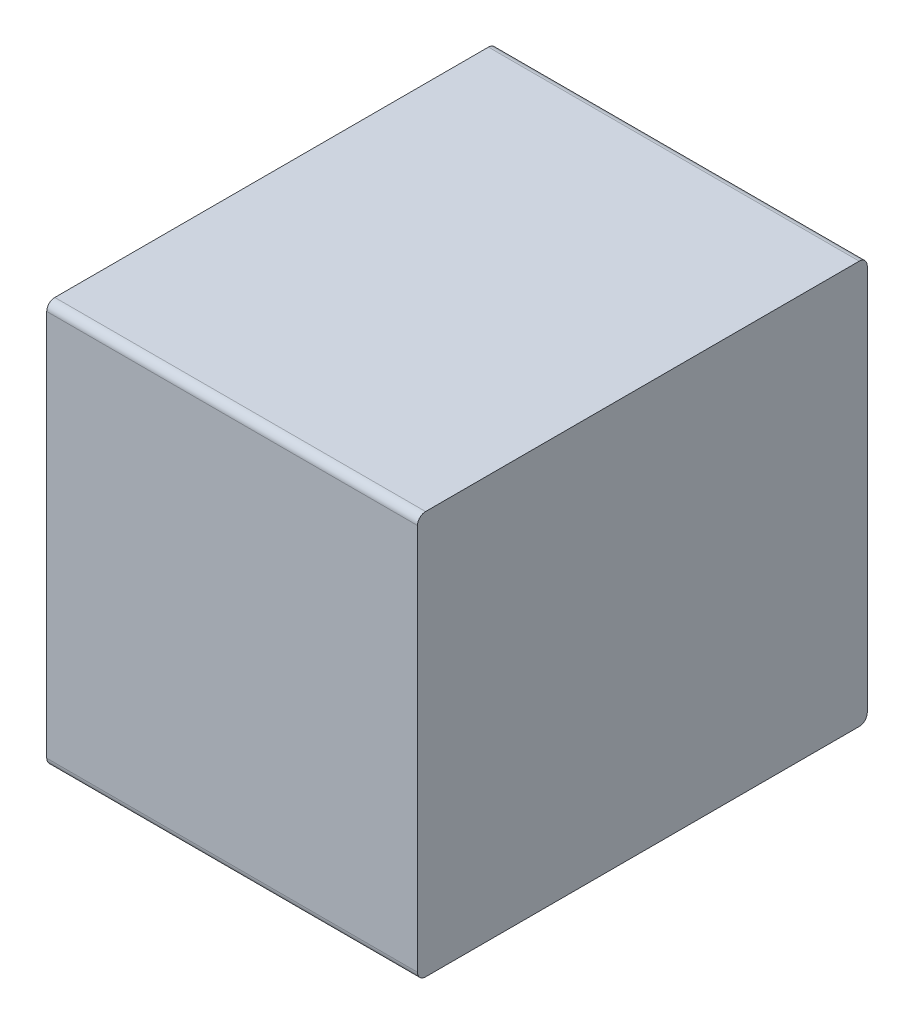
ISO-10303-21;
HEADER;
FILE_DESCRIPTION(('STEP AP214'),'2;1');
FILE_NAME('part.step','',(''),(''),'','','');
FILE_SCHEMA(('AUTOMOTIVE_DESIGN { 1 0 10303 214 1 1 1 1 }'));
ENDSEC;
DATA;
#1=APPLICATION_CONTEXT('core data for automotive mechanical design processes');
#2=APPLICATION_PROTOCOL_DEFINITION('international standard','automotive_design',2000,#1);
#3=PRODUCT_CONTEXT('',#1,'mechanical');
#4=PRODUCT('Part','Part','',(#3));
#5=PRODUCT_RELATED_PRODUCT_CATEGORY('part','',(#4));
#6=PRODUCT_DEFINITION_FORMATION('','',#4);
#7=PRODUCT_DEFINITION_CONTEXT('part definition',#1,'design');
#8=PRODUCT_DEFINITION('design','',#6,#7);
#9=PRODUCT_DEFINITION_SHAPE('','',#8);
#10=(LENGTH_UNIT() NAMED_UNIT(*) SI_UNIT(.MILLI.,.METRE.));
#11=(NAMED_UNIT(*) PLANE_ANGLE_UNIT() SI_UNIT($,.RADIAN.));
#12=(NAMED_UNIT(*) SI_UNIT($,.STERADIAN.) SOLID_ANGLE_UNIT());
#13=UNCERTAINTY_MEASURE_WITH_UNIT(LENGTH_MEASURE(1.E-05),#10,'distance_accuracy_value','');
#14=(GEOMETRIC_REPRESENTATION_CONTEXT(3) GLOBAL_UNCERTAINTY_ASSIGNED_CONTEXT((#13)) GLOBAL_UNIT_ASSIGNED_CONTEXT((#10,
#11,#12)) REPRESENTATION_CONTEXT('',''));
#15=CARTESIAN_POINT('',(0.,0.,0.));
#16=DIRECTION('',(0.,0.,1.));
#17=DIRECTION('',(1.,0.,0.));
#18=AXIS2_PLACEMENT_3D('',#15,#16,#17);
#19=CARTESIAN_POINT('',(1.15,1.799359773159,2.79));
#20=DIRECTION('',(1.,0.,0.));
#21=DIRECTION('',(0.,-1.,0.));
#22=AXIS2_PLACEMENT_3D('',#19,#20,#21);
#23=PLANE('',#22);
#24=CARTESIAN_POINT('',(1.15,-1.2,2.74));
#25=DIRECTION('',(1.,0.,0.));
#26=DIRECTION('',(0.,-0.707106781186548,0.707106781186548));
#27=AXIS2_PLACEMENT_3D('',#24,#25,#26);
#28=CIRCLE('',#27,0.05);
#29=CARTESIAN_POINT('',(1.15,-1.2,2.79));
#30=VERTEX_POINT('',#29);
#31=CARTESIAN_POINT('',(1.15,-1.25,2.74));
#32=VERTEX_POINT('',#31);
#33=EDGE_CURVE('E11',#30,#32,#28,.T.);
#34=ORIENTED_EDGE('',*,*,#33,.T.);
#35=DIRECTION('',(0.,0.,-1.));
#36=VECTOR('',#35,1.);
#37=CARTESIAN_POINT('',(1.15,-1.25,1.395));
#38=LINE('',#37,#36);
#39=CARTESIAN_POINT('',(1.15,-1.25,0.05));
#40=VERTEX_POINT('',#39);
#41=EDGE_CURVE('E24',#32,#40,#38,.T.);
#42=ORIENTED_EDGE('',*,*,#41,.T.);
#43=CARTESIAN_POINT('',(1.15,-1.2,0.05));
#44=DIRECTION('',(1.,0.,0.));
#45=DIRECTION('',(0.,-0.707106781186548,-0.707106781186547));
#46=AXIS2_PLACEMENT_3D('',#43,#44,#45);
#47=CIRCLE('',#46,0.05);
#48=CARTESIAN_POINT('',(1.15,-1.2,0.));
#49=VERTEX_POINT('',#48);
#50=EDGE_CURVE('E99',#40,#49,#47,.T.);
#51=ORIENTED_EDGE('',*,*,#50,.T.);
#52=DIRECTION('',(0.,1.,0.));
#53=VECTOR('',#52,1.);
#54=CARTESIAN_POINT('',(1.15,0.899679886579503,0.));
#55=LINE('',#54,#53);
#56=CARTESIAN_POINT('',(1.15,1.2,0.));
#57=VERTEX_POINT('',#56);
#58=EDGE_CURVE('E137',#49,#57,#55,.T.);
#59=ORIENTED_EDGE('',*,*,#58,.T.);
#60=CARTESIAN_POINT('',(1.15,1.2,0.05));
#61=DIRECTION('',(1.,0.,0.));
#62=DIRECTION('',(0.,0.707106781186548,-0.707106781186547));
#63=AXIS2_PLACEMENT_3D('',#60,#61,#62);
#64=CIRCLE('',#63,0.05);
#65=CARTESIAN_POINT('',(1.15,1.25,0.05));
#66=VERTEX_POINT('',#65);
#67=EDGE_CURVE('E135',#57,#66,#64,.T.);
#68=ORIENTED_EDGE('',*,*,#67,.T.);
#69=DIRECTION('',(0.,0.,1.));
#70=VECTOR('',#69,1.);
#71=CARTESIAN_POINT('',(1.15,1.25,1.395));
#72=LINE('',#71,#70);
#73=CARTESIAN_POINT('',(1.15,1.25,2.74));
#74=VERTEX_POINT('',#73);
#75=EDGE_CURVE('E133',#66,#74,#72,.T.);
#76=ORIENTED_EDGE('',*,*,#75,.T.);
#77=CARTESIAN_POINT('',(1.15,1.2,2.74));
#78=DIRECTION('',(1.,0.,0.));
#79=DIRECTION('',(0.,0.707106781186548,0.707106781186548));
#80=AXIS2_PLACEMENT_3D('',#77,#78,#79);
#81=CIRCLE('',#80,0.05);
#82=CARTESIAN_POINT('',(1.15,1.2,2.79));
#83=VERTEX_POINT('',#82);
#84=EDGE_CURVE('E131',#74,#83,#81,.T.);
#85=ORIENTED_EDGE('',*,*,#84,.T.);
#86=DIRECTION('',(0.,-1.,0.));
#87=VECTOR('',#86,1.);
#88=CARTESIAN_POINT('',(1.15,0.899679886579503,2.79));
#89=LINE('',#88,#87);
#90=EDGE_CURVE('E129',#83,#30,#89,.T.);
#91=ORIENTED_EDGE('',*,*,#90,.T.);
#92=EDGE_LOOP('',(#34,#42,#51,#59,#68,#76,#85,#91));
#93=FACE_BOUND('',#92,.T.);
#94=ADVANCED_FACE('F17',(#93),#23,.T.);
#95=CARTESIAN_POINT('',(-1.15,-1.799359773159,2.79));
#96=DIRECTION('',(-1.,0.,0.));
#97=DIRECTION('',(0.,1.,0.));
#98=AXIS2_PLACEMENT_3D('',#95,#96,#97);
#99=PLANE('',#98);
#100=CARTESIAN_POINT('',(-1.15,-1.2,2.74));
#101=DIRECTION('',(-1.,0.,0.));
#102=DIRECTION('',(0.,-0.707106781186548,0.707106781186548));
#103=AXIS2_PLACEMENT_3D('',#100,#101,#102);
#104=CIRCLE('',#103,0.05);
#105=CARTESIAN_POINT('',(-1.15,-1.25,2.74));
#106=VERTEX_POINT('',#105);
#107=CARTESIAN_POINT('',(-1.15,-1.2,2.79));
#108=VERTEX_POINT('',#107);
#109=EDGE_CURVE('E127',#106,#108,#104,.T.);
#110=ORIENTED_EDGE('',*,*,#109,.T.);
#111=DIRECTION('',(0.,1.,0.));
#112=VECTOR('',#111,1.);
#113=CARTESIAN_POINT('',(-1.15,-0.899679886579503,2.79));
#114=LINE('',#113,#112);
#115=CARTESIAN_POINT('',(-1.15,1.2,2.79));
#116=VERTEX_POINT('',#115);
#117=EDGE_CURVE('E125',#108,#116,#114,.T.);
#118=ORIENTED_EDGE('',*,*,#117,.T.);
#119=CARTESIAN_POINT('',(-1.15,1.2,2.74));
#120=DIRECTION('',(-1.,0.,0.));
#121=DIRECTION('',(0.,0.707106781186548,0.707106781186548));
#122=AXIS2_PLACEMENT_3D('',#119,#120,#121);
#123=CIRCLE('',#122,0.05);
#124=CARTESIAN_POINT('',(-1.15,1.25,2.74));
#125=VERTEX_POINT('',#124);
#126=EDGE_CURVE('E123',#116,#125,#123,.T.);
#127=ORIENTED_EDGE('',*,*,#126,.T.);
#128=DIRECTION('',(0.,0.,-1.));
#129=VECTOR('',#128,1.);
#130=CARTESIAN_POINT('',(-1.15,1.25,1.395));
#131=LINE('',#130,#129);
#132=CARTESIAN_POINT('',(-1.15,1.25,0.05));
#133=VERTEX_POINT('',#132);
#134=EDGE_CURVE('E121',#125,#133,#131,.T.);
#135=ORIENTED_EDGE('',*,*,#134,.T.);
#136=CARTESIAN_POINT('',(-1.15,1.2,0.05));
#137=DIRECTION('',(-1.,0.,0.));
#138=DIRECTION('',(0.,0.707106781186548,-0.707106781186547));
#139=AXIS2_PLACEMENT_3D('',#136,#137,#138);
#140=CIRCLE('',#139,0.05);
#141=CARTESIAN_POINT('',(-1.15,1.2,0.));
#142=VERTEX_POINT('',#141);
#143=EDGE_CURVE('E119',#133,#142,#140,.T.);
#144=ORIENTED_EDGE('',*,*,#143,.T.);
#145=DIRECTION('',(0.,-1.,0.));
#146=VECTOR('',#145,1.);
#147=CARTESIAN_POINT('',(-1.15,-0.899679886579503,0.));
#148=LINE('',#147,#146);
#149=CARTESIAN_POINT('',(-1.15,-1.2,0.));
#150=VERTEX_POINT('',#149);
#151=EDGE_CURVE('E84',#142,#150,#148,.T.);
#152=ORIENTED_EDGE('',*,*,#151,.T.);
#153=CARTESIAN_POINT('',(-1.15,-1.2,0.05));
#154=DIRECTION('',(-1.,0.,0.));
#155=DIRECTION('',(0.,-0.707106781186548,-0.707106781186547));
#156=AXIS2_PLACEMENT_3D('',#153,#154,#155);
#157=CIRCLE('',#156,0.05);
#158=CARTESIAN_POINT('',(-1.15,-1.25,0.05));
#159=VERTEX_POINT('',#158);
#160=EDGE_CURVE('E78',#150,#159,#157,.T.);
#161=ORIENTED_EDGE('',*,*,#160,.T.);
#162=DIRECTION('',(0.,0.,1.));
#163=VECTOR('',#162,1.);
#164=CARTESIAN_POINT('',(-1.15,-1.25,1.395));
#165=LINE('',#164,#163);
#166=EDGE_CURVE('E81',#159,#106,#165,.T.);
#167=ORIENTED_EDGE('',*,*,#166,.T.);
#168=EDGE_LOOP('',(#110,#118,#127,#135,#144,#152,#161,#167));
#169=FACE_BOUND('',#168,.T.);
#170=ADVANCED_FACE('F80',(#169),#99,.T.);
#171=CARTESIAN_POINT('',(0.,0.,0.));
#172=DIRECTION('',(0.,0.,1.));
#173=DIRECTION('',(1.,0.,0.));
#174=AXIS2_PLACEMENT_3D('',#171,#172,#173);
#175=PLANE('',#174);
#176=ORIENTED_EDGE('',*,*,#151,.F.);
#177=DIRECTION('',(-1.,0.,0.));
#178=VECTOR('',#177,1.);
#179=CARTESIAN_POINT('',(0.825,1.2,0.));
#180=LINE('',#179,#178);
#181=EDGE_CURVE('E95',#57,#142,#180,.T.);
#182=ORIENTED_EDGE('',*,*,#181,.F.);
#183=ORIENTED_EDGE('',*,*,#58,.F.);
#184=DIRECTION('',(1.,0.,0.));
#185=VECTOR('',#184,1.);
#186=CARTESIAN_POINT('',(-0.825,-1.2,0.));
#187=LINE('',#186,#185);
#188=EDGE_CURVE('E114',#150,#49,#187,.T.);
#189=ORIENTED_EDGE('',*,*,#188,.F.);
#190=EDGE_LOOP('',(#176,#182,#183,#189));
#191=FACE_BOUND('',#190,.T.);
#192=ADVANCED_FACE('F163',(#191),#175,.F.);
#193=CARTESIAN_POINT('',(0.825,1.2,0.05));
#194=DIRECTION('',(-1.,0.,0.));
#195=DIRECTION('',(0.,0.707106781186548,-0.707106781186547));
#196=AXIS2_PLACEMENT_3D('',#193,#194,#195);
#197=CYLINDRICAL_SURFACE('',#196,0.05);
#198=ORIENTED_EDGE('',*,*,#143,.F.);
#199=DIRECTION('',(1.,0.,0.));
#200=VECTOR('',#199,1.);
#201=CARTESIAN_POINT('',(0.825,1.25,0.05));
#202=LINE('',#201,#200);
#203=EDGE_CURVE('E111',#133,#66,#202,.T.);
#204=ORIENTED_EDGE('',*,*,#203,.T.);
#205=ORIENTED_EDGE('',*,*,#67,.F.);
#206=ORIENTED_EDGE('',*,*,#181,.T.);
#207=EDGE_LOOP('',(#198,#204,#205,#206));
#208=FACE_BOUND('',#207,.T.);
#209=ADVANCED_FACE('F160',(#208),#197,.T.);
#210=CARTESIAN_POINT('',(1.65,1.25,0.));
#211=DIRECTION('',(0.,1.,0.));
#212=DIRECTION('',(-1.,0.,0.));
#213=AXIS2_PLACEMENT_3D('',#210,#211,#212);
#214=PLANE('',#213);
#215=ORIENTED_EDGE('',*,*,#134,.F.);
#216=DIRECTION('',(-1.,0.,0.));
#217=VECTOR('',#216,1.);
#218=CARTESIAN_POINT('',(0.825,1.25,2.74));
#219=LINE('',#218,#217);
#220=EDGE_CURVE('E103',#74,#125,#219,.T.);
#221=ORIENTED_EDGE('',*,*,#220,.F.);
#222=ORIENTED_EDGE('',*,*,#75,.F.);
#223=ORIENTED_EDGE('',*,*,#203,.F.);
#224=EDGE_LOOP('',(#215,#221,#222,#223));
#225=FACE_BOUND('',#224,.T.);
#226=ADVANCED_FACE('F156',(#225),#214,.T.);
#227=CARTESIAN_POINT('',(0.825,1.2,2.74));
#228=DIRECTION('',(-1.,0.,0.));
#229=DIRECTION('',(0.,0.707106781186548,0.707106781186548));
#230=AXIS2_PLACEMENT_3D('',#227,#228,#229);
#231=CYLINDRICAL_SURFACE('',#230,0.05);
#232=ORIENTED_EDGE('',*,*,#126,.F.);
#233=DIRECTION('',(1.,0.,0.));
#234=VECTOR('',#233,1.);
#235=CARTESIAN_POINT('',(0.825,1.2,2.79));
#236=LINE('',#235,#234);
#237=EDGE_CURVE('E100',#116,#83,#236,.T.);
#238=ORIENTED_EDGE('',*,*,#237,.T.);
#239=ORIENTED_EDGE('',*,*,#84,.F.);
#240=ORIENTED_EDGE('',*,*,#220,.T.);
#241=EDGE_LOOP('',(#232,#238,#239,#240));
#242=FACE_BOUND('',#241,.T.);
#243=ADVANCED_FACE('F150',(#242),#231,.T.);
#244=CARTESIAN_POINT('',(-0.825,-1.2,0.05));
#245=DIRECTION('',(1.,0.,0.));
#246=DIRECTION('',(0.,-0.707106781186548,-0.707106781186547));
#247=AXIS2_PLACEMENT_3D('',#244,#245,#246);
#248=CYLINDRICAL_SURFACE('',#247,0.05);
#249=ORIENTED_EDGE('',*,*,#160,.F.);
#250=ORIENTED_EDGE('',*,*,#188,.T.);
#251=ORIENTED_EDGE('',*,*,#50,.F.);
#252=DIRECTION('',(-1.,0.,0.));
#253=VECTOR('',#252,1.);
#254=CARTESIAN_POINT('',(-0.825,-1.25,0.05));
#255=LINE('',#254,#253);
#256=EDGE_CURVE('E93',#40,#159,#255,.T.);
#257=ORIENTED_EDGE('',*,*,#256,.T.);
#258=EDGE_LOOP('',(#249,#250,#251,#257));
#259=FACE_BOUND('',#258,.T.);
#260=ADVANCED_FACE('F98',(#259),#248,.T.);
#261=CARTESIAN_POINT('',(-1.65,-1.25,0.));
#262=DIRECTION('',(0.,-1.,0.));
#263=DIRECTION('',(1.,0.,0.));
#264=AXIS2_PLACEMENT_3D('',#261,#262,#263);
#265=PLANE('',#264);
#266=ORIENTED_EDGE('',*,*,#166,.F.);
#267=ORIENTED_EDGE('',*,*,#256,.F.);
#268=ORIENTED_EDGE('',*,*,#41,.F.);
#269=DIRECTION('',(1.,0.,0.));
#270=VECTOR('',#269,1.);
#271=CARTESIAN_POINT('',(-0.825,-1.25,2.74));
#272=LINE('',#271,#270);
#273=EDGE_CURVE('E94',#106,#32,#272,.T.);
#274=ORIENTED_EDGE('',*,*,#273,.F.);
#275=EDGE_LOOP('',(#266,#267,#268,#274));
#276=FACE_BOUND('',#275,.T.);
#277=ADVANCED_FACE('F92',(#276),#265,.T.);
#278=CARTESIAN_POINT('',(-0.825,-1.2,2.74));
#279=DIRECTION('',(1.,0.,0.));
#280=DIRECTION('',(0.,-0.707106781186548,0.707106781186548));
#281=AXIS2_PLACEMENT_3D('',#278,#279,#280);
#282=CYLINDRICAL_SURFACE('',#281,0.05);
#283=ORIENTED_EDGE('',*,*,#109,.F.);
#284=ORIENTED_EDGE('',*,*,#273,.T.);
#285=ORIENTED_EDGE('',*,*,#33,.F.);
#286=DIRECTION('',(-1.,0.,0.));
#287=VECTOR('',#286,1.);
#288=CARTESIAN_POINT('',(-0.825,-1.2,2.79));
#289=LINE('',#288,#287);
#290=EDGE_CURVE('E105',#30,#108,#289,.T.);
#291=ORIENTED_EDGE('',*,*,#290,.T.);
#292=EDGE_LOOP('',(#283,#284,#285,#291));
#293=FACE_BOUND('',#292,.T.);
#294=ADVANCED_FACE('F140',(#293),#282,.T.);
#295=CARTESIAN_POINT('',(0.,0.,2.79));
#296=DIRECTION('',(0.,0.,1.));
#297=DIRECTION('',(1.,0.,0.));
#298=AXIS2_PLACEMENT_3D('',#295,#296,#297);
#299=PLANE('',#298);
#300=ORIENTED_EDGE('',*,*,#117,.F.);
#301=ORIENTED_EDGE('',*,*,#290,.F.);
#302=ORIENTED_EDGE('',*,*,#90,.F.);
#303=ORIENTED_EDGE('',*,*,#237,.F.);
#304=EDGE_LOOP('',(#300,#301,#302,#303));
#305=FACE_BOUND('',#304,.T.);
#306=ADVANCED_FACE('F146',(#305),#299,.T.);
#307=CLOSED_SHELL('',(#94,#170,#192,#209,#226,#243,#260,#277,#294,#306));
#308=MANIFOLD_SOLID_BREP('B1',#307);
#309=ADVANCED_BREP_SHAPE_REPRESENTATION('',(#18,#308),#14);
#310=SHAPE_DEFINITION_REPRESENTATION(#9,#309);
ENDSEC;
END-ISO-10303-21;
